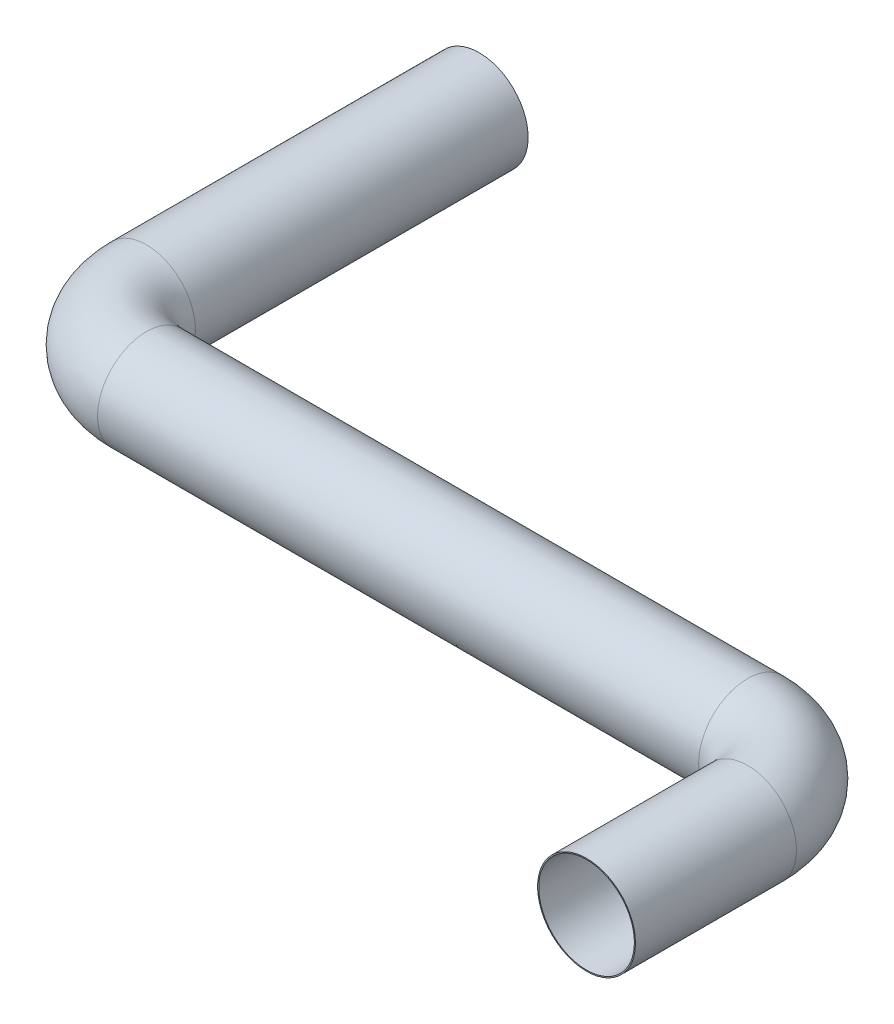
ISO-10303-21;
HEADER;
FILE_DESCRIPTION(('STEP AP214'),'2;1');
FILE_NAME('part.step','',(''),(''),'','','');
FILE_SCHEMA(('AUTOMOTIVE_DESIGN { 1 0 10303 214 1 1 1 1 }'));
ENDSEC;
DATA;
#1=APPLICATION_CONTEXT('core data for automotive mechanical design processes');
#2=APPLICATION_PROTOCOL_DEFINITION('international standard','automotive_design',2000,#1);
#3=PRODUCT_CONTEXT('',#1,'mechanical');
#4=PRODUCT('Part','Part','',(#3));
#5=PRODUCT_RELATED_PRODUCT_CATEGORY('part','',(#4));
#6=PRODUCT_DEFINITION_FORMATION('','',#4);
#7=PRODUCT_DEFINITION_CONTEXT('part definition',#1,'design');
#8=PRODUCT_DEFINITION('design','',#6,#7);
#9=PRODUCT_DEFINITION_SHAPE('','',#8);
#10=(LENGTH_UNIT() NAMED_UNIT(*) SI_UNIT(.MILLI.,.METRE.));
#11=(NAMED_UNIT(*) PLANE_ANGLE_UNIT() SI_UNIT($,.RADIAN.));
#12=(NAMED_UNIT(*) SI_UNIT($,.STERADIAN.) SOLID_ANGLE_UNIT());
#13=UNCERTAINTY_MEASURE_WITH_UNIT(LENGTH_MEASURE(1.E-05),#10,'distance_accuracy_value','');
#14=(GEOMETRIC_REPRESENTATION_CONTEXT(3) GLOBAL_UNCERTAINTY_ASSIGNED_CONTEXT((#13)) GLOBAL_UNIT_ASSIGNED_CONTEXT((#10,
#11,#12)) REPRESENTATION_CONTEXT('',''));
#15=CARTESIAN_POINT('',(0.,0.,0.));
#16=DIRECTION('',(0.,0.,1.));
#17=DIRECTION('',(1.,0.,0.));
#18=AXIS2_PLACEMENT_3D('',#15,#16,#17);
#19=CARTESIAN_POINT('',(0.,0.,0.));
#20=DIRECTION('',(0.,0.,-1.));
#21=DIRECTION('',(-1.,0.,0.));
#22=AXIS2_PLACEMENT_3D('',#19,#20,#21);
#23=CYLINDRICAL_SURFACE('',#22,45.59);
#24=CARTESIAN_POINT('',(0.,0.,-149.999999999999));
#25=DIRECTION('',(0.,0.,1.));
#26=DIRECTION('',(1.,0.,0.));
#27=AXIS2_PLACEMENT_3D('',#24,#25,#26);
#28=CIRCLE('',#27,45.59);
#29=CARTESIAN_POINT('',(45.59,0.,-149.999999999999));
#30=VERTEX_POINT('',#29);
#31=EDGE_CURVE('E69',#30,#30,#28,.T.);
#32=ORIENTED_EDGE('',*,*,#31,.T.);
#33=EDGE_LOOP('',(#32));
#34=FACE_BOUND('',#33,.T.);
#35=CARTESIAN_POINT('',(0.,0.,0.));
#36=DIRECTION('',(0.,0.,1.));
#37=DIRECTION('',(1.,0.,0.));
#38=AXIS2_PLACEMENT_3D('',#35,#36,#37);
#39=CIRCLE('',#38,45.59);
#40=CARTESIAN_POINT('',(45.59,0.,0.));
#41=VERTEX_POINT('',#40);
#42=EDGE_CURVE('E48',#41,#41,#39,.T.);
#43=ORIENTED_EDGE('',*,*,#42,.F.);
#44=EDGE_LOOP('',(#43));
#45=FACE_BOUND('',#44,.T.);
#46=ADVANCED_FACE('F33',(#34,#45),#23,.T.);
#47=CARTESIAN_POINT('',(-70.,0.,-150.));
#48=DIRECTION('',(0.,1.,0.));
#49=DIRECTION('',(0.,0.,1.));
#50=AXIS2_PLACEMENT_3D('',#47,#48,#49);
#51=TOROIDAL_SURFACE('',#50,70.,45.59);
#52=CARTESIAN_POINT('',(-70.0000000000005,0.,-220.));
#53=DIRECTION('',(1.,0.,0.));
#54=DIRECTION('',(0.,0.,-1.));
#55=AXIS2_PLACEMENT_3D('',#52,#53,#54);
#56=CIRCLE('',#55,45.59);
#57=CARTESIAN_POINT('',(-70.0000000000007,0.,-265.59));
#58=VERTEX_POINT('',#57);
#59=EDGE_CURVE('E72',#58,#58,#56,.T.);
#60=CARTESIAN_POINT('',(-70.,0.,-150.));
#61=DIRECTION('',(0.,1.,0.));
#62=DIRECTION('',(0.,0.,1.));
#63=AXIS2_PLACEMENT_3D('',#60,#61,#62);
#64=CIRCLE('',#63,115.59);
#65=EDGE_CURVE('',#30,#58,#64,.T.);
#66=ORIENTED_EDGE('',*,*,#31,.F.);
#67=ORIENTED_EDGE('',*,*,#59,.T.);
#68=ORIENTED_EDGE('',*,*,#65,.T.);
#69=ORIENTED_EDGE('',*,*,#65,.F.);
#70=EDGE_LOOP('',(#66,#68,#67,#69));
#71=FACE_BOUND('',#70,.T.);
#72=ADVANCED_FACE('F107',(#71),#51,.T.);
#73=CARTESIAN_POINT('',(-70.0000000000005,0.,-220.));
#74=DIRECTION('',(-1.,0.,0.));
#75=DIRECTION('',(0.,0.,1.));
#76=AXIS2_PLACEMENT_3D('',#73,#74,#75);
#77=CYLINDRICAL_SURFACE('',#76,45.59);
#78=CARTESIAN_POINT('',(-629.999999999999,0.,-220.));
#79=DIRECTION('',(1.,0.,0.));
#80=DIRECTION('',(0.,0.,-1.));
#81=AXIS2_PLACEMENT_3D('',#78,#79,#80);
#82=CIRCLE('',#81,45.59);
#83=CARTESIAN_POINT('',(-629.999999999999,0.,-174.41));
#84=VERTEX_POINT('',#83);
#85=EDGE_CURVE('E74',#84,#84,#82,.T.);
#86=ORIENTED_EDGE('',*,*,#85,.T.);
#87=EDGE_LOOP('',(#86));
#88=FACE_BOUND('',#87,.T.);
#89=ORIENTED_EDGE('',*,*,#59,.F.);
#90=EDGE_LOOP('',(#89));
#91=FACE_BOUND('',#90,.T.);
#92=ADVANCED_FACE('F113',(#88,#91),#77,.T.);
#93=CARTESIAN_POINT('',(-630.,0.,-290.));
#94=DIRECTION('',(0.,-1.,0.));
#95=DIRECTION('',(0.,0.,-1.));
#96=AXIS2_PLACEMENT_3D('',#93,#94,#95);
#97=TOROIDAL_SURFACE('',#96,70.,45.59);
#98=CARTESIAN_POINT('',(-700.,0.,-290.));
#99=DIRECTION('',(0.,0.,1.));
#100=DIRECTION('',(1.,0.,0.));
#101=AXIS2_PLACEMENT_3D('',#98,#99,#100);
#102=CIRCLE('',#101,45.59);
#103=CARTESIAN_POINT('',(-745.59,0.,-290.000000000001));
#104=VERTEX_POINT('',#103);
#105=EDGE_CURVE('E37',#104,#104,#102,.T.);
#106=CARTESIAN_POINT('',(-630.,0.,-290.));
#107=DIRECTION('',(0.,-1.,0.));
#108=DIRECTION('',(0.,0.,-1.));
#109=AXIS2_PLACEMENT_3D('',#106,#107,#108);
#110=CIRCLE('',#109,115.59);
#111=EDGE_CURVE('',#84,#104,#110,.T.);
#112=ORIENTED_EDGE('',*,*,#85,.F.);
#113=ORIENTED_EDGE('',*,*,#105,.T.);
#114=ORIENTED_EDGE('',*,*,#111,.T.);
#115=ORIENTED_EDGE('',*,*,#111,.F.);
#116=EDGE_LOOP('',(#112,#114,#113,#115));
#117=FACE_BOUND('',#116,.T.);
#118=ADVANCED_FACE('F81',(#117),#97,.T.);
#119=CARTESIAN_POINT('',(-700.,0.,-290.));
#120=DIRECTION('',(0.,0.,-1.));
#121=DIRECTION('',(-1.,0.,0.));
#122=AXIS2_PLACEMENT_3D('',#119,#120,#121);
#123=CYLINDRICAL_SURFACE('',#122,45.59);
#124=ORIENTED_EDGE('',*,*,#105,.F.);
#125=EDGE_LOOP('',(#124));
#126=FACE_BOUND('',#125,.T.);
#127=CARTESIAN_POINT('',(-700.,0.,-600.));
#128=DIRECTION('',(0.,0.,-1.));
#129=DIRECTION('',(-1.,0.,0.));
#130=AXIS2_PLACEMENT_3D('',#127,#128,#129);
#131=CIRCLE('',#130,45.59);
#132=CARTESIAN_POINT('',(-745.59,0.,-600.));
#133=VERTEX_POINT('',#132);
#134=EDGE_CURVE('E62',#133,#133,#131,.T.);
#135=ORIENTED_EDGE('',*,*,#134,.F.);
#136=EDGE_LOOP('',(#135));
#137=FACE_BOUND('',#136,.T.);
#138=ADVANCED_FACE('F35',(#126,#137),#123,.T.);
#139=CARTESIAN_POINT('',(0.,0.,0.));
#140=DIRECTION('',(0.,0.,1.));
#141=DIRECTION('',(1.,0.,0.));
#142=AXIS2_PLACEMENT_3D('',#139,#140,#141);
#143=PLANE('',#142);
#144=CARTESIAN_POINT('',(0.,0.,0.));
#145=DIRECTION('',(0.,0.,1.));
#146=DIRECTION('',(1.,0.,0.));
#147=AXIS2_PLACEMENT_3D('',#144,#145,#146);
#148=CIRCLE('',#147,44.59);
#149=CARTESIAN_POINT('',(44.59,0.,0.));
#150=VERTEX_POINT('',#149);
#151=EDGE_CURVE('E52',#150,#150,#148,.F.);
#152=ORIENTED_EDGE('',*,*,#151,.T.);
#153=EDGE_LOOP('',(#152));
#154=FACE_BOUND('',#153,.T.);
#155=ORIENTED_EDGE('',*,*,#42,.T.);
#156=EDGE_LOOP('',(#155));
#157=FACE_BOUND('',#156,.T.);
#158=ADVANCED_FACE('F86',(#154,#157),#143,.T.);
#159=CARTESIAN_POINT('',(0.,0.,0.));
#160=DIRECTION('',(0.,0.,-1.));
#161=DIRECTION('',(-1.,0.,0.));
#162=AXIS2_PLACEMENT_3D('',#159,#160,#161);
#163=CYLINDRICAL_SURFACE('',#162,44.59);
#164=CARTESIAN_POINT('',(0.,0.,-149.999999999999));
#165=DIRECTION('',(0.,0.,1.));
#166=DIRECTION('',(1.,0.,0.));
#167=AXIS2_PLACEMENT_3D('',#164,#165,#166);
#168=CIRCLE('',#167,44.59);
#169=CARTESIAN_POINT('',(44.59,0.,-149.999999999999));
#170=VERTEX_POINT('',#169);
#171=EDGE_CURVE('E55',#170,#170,#168,.F.);
#172=ORIENTED_EDGE('',*,*,#171,.T.);
#173=EDGE_LOOP('',(#172));
#174=FACE_BOUND('',#173,.T.);
#175=ORIENTED_EDGE('',*,*,#151,.F.);
#176=EDGE_LOOP('',(#175));
#177=FACE_BOUND('',#176,.T.);
#178=ADVANCED_FACE('F53',(#174,#177),#163,.F.);
#179=CARTESIAN_POINT('',(-70.,0.,-150.));
#180=DIRECTION('',(0.,1.,0.));
#181=DIRECTION('',(0.,0.,1.));
#182=AXIS2_PLACEMENT_3D('',#179,#180,#181);
#183=TOROIDAL_SURFACE('',#182,70.,44.59);
#184=CARTESIAN_POINT('',(-70.0000000000005,0.,-220.));
#185=DIRECTION('',(1.,0.,0.));
#186=DIRECTION('',(0.,0.,-1.));
#187=AXIS2_PLACEMENT_3D('',#184,#185,#186);
#188=CIRCLE('',#187,44.59);
#189=CARTESIAN_POINT('',(-70.0000000000007,0.,-264.59));
#190=VERTEX_POINT('',#189);
#191=EDGE_CURVE('E58',#190,#190,#188,.F.);
#192=CARTESIAN_POINT('',(-70.,0.,-150.));
#193=DIRECTION('',(0.,1.,0.));
#194=DIRECTION('',(0.,0.,1.));
#195=AXIS2_PLACEMENT_3D('',#192,#193,#194);
#196=CIRCLE('',#195,114.59);
#197=EDGE_CURVE('',#170,#190,#196,.T.);
#198=ORIENTED_EDGE('',*,*,#171,.F.);
#199=ORIENTED_EDGE('',*,*,#191,.T.);
#200=ORIENTED_EDGE('',*,*,#197,.T.);
#201=ORIENTED_EDGE('',*,*,#197,.F.);
#202=EDGE_LOOP('',(#198,#200,#199,#201));
#203=FACE_BOUND('',#202,.T.);
#204=ADVANCED_FACE('F142',(#203),#183,.F.);
#205=CARTESIAN_POINT('',(-70.0000000000005,0.,-220.));
#206=DIRECTION('',(-1.,0.,0.));
#207=DIRECTION('',(0.,0.,1.));
#208=AXIS2_PLACEMENT_3D('',#205,#206,#207);
#209=CYLINDRICAL_SURFACE('',#208,44.59);
#210=CARTESIAN_POINT('',(-629.999999999999,0.,-220.));
#211=DIRECTION('',(1.,0.,0.));
#212=DIRECTION('',(0.,0.,-1.));
#213=AXIS2_PLACEMENT_3D('',#210,#211,#212);
#214=CIRCLE('',#213,44.59);
#215=CARTESIAN_POINT('',(-629.999999999999,0.,-175.41));
#216=VERTEX_POINT('',#215);
#217=EDGE_CURVE('E42',#216,#216,#214,.F.);
#218=ORIENTED_EDGE('',*,*,#217,.T.);
#219=EDGE_LOOP('',(#218));
#220=FACE_BOUND('',#219,.T.);
#221=ORIENTED_EDGE('',*,*,#191,.F.);
#222=EDGE_LOOP('',(#221));
#223=FACE_BOUND('',#222,.T.);
#224=ADVANCED_FACE('F149',(#220,#223),#209,.F.);
#225=CARTESIAN_POINT('',(-630.,0.,-290.));
#226=DIRECTION('',(0.,-1.,0.));
#227=DIRECTION('',(0.,0.,-1.));
#228=AXIS2_PLACEMENT_3D('',#225,#226,#227);
#229=TOROIDAL_SURFACE('',#228,70.,44.59);
#230=CARTESIAN_POINT('',(-700.,0.,-290.));
#231=DIRECTION('',(0.,0.,1.));
#232=DIRECTION('',(1.,0.,0.));
#233=AXIS2_PLACEMENT_3D('',#230,#231,#232);
#234=CIRCLE('',#233,44.59);
#235=CARTESIAN_POINT('',(-744.59,0.,-290.000000000001));
#236=VERTEX_POINT('',#235);
#237=EDGE_CURVE('E11',#236,#236,#234,.F.);
#238=CARTESIAN_POINT('',(-630.,0.,-290.));
#239=DIRECTION('',(0.,-1.,0.));
#240=DIRECTION('',(0.,0.,-1.));
#241=AXIS2_PLACEMENT_3D('',#238,#239,#240);
#242=CIRCLE('',#241,114.59);
#243=EDGE_CURVE('',#216,#236,#242,.T.);
#244=ORIENTED_EDGE('',*,*,#217,.F.);
#245=ORIENTED_EDGE('',*,*,#237,.T.);
#246=ORIENTED_EDGE('',*,*,#243,.T.);
#247=ORIENTED_EDGE('',*,*,#243,.F.);
#248=EDGE_LOOP('',(#244,#246,#245,#247));
#249=FACE_BOUND('',#248,.T.);
#250=ADVANCED_FACE('F102',(#249),#229,.F.);
#251=CARTESIAN_POINT('',(-700.,0.,-290.));
#252=DIRECTION('',(0.,0.,-1.));
#253=DIRECTION('',(-1.,0.,0.));
#254=AXIS2_PLACEMENT_3D('',#251,#252,#253);
#255=CYLINDRICAL_SURFACE('',#254,44.59);
#256=ORIENTED_EDGE('',*,*,#237,.F.);
#257=EDGE_LOOP('',(#256));
#258=FACE_BOUND('',#257,.T.);
#259=CARTESIAN_POINT('',(-700.,0.,-600.));
#260=DIRECTION('',(0.,0.,-1.));
#261=DIRECTION('',(-1.,0.,0.));
#262=AXIS2_PLACEMENT_3D('',#259,#260,#261);
#263=CIRCLE('',#262,44.59);
#264=CARTESIAN_POINT('',(-744.59,0.,-600.));
#265=VERTEX_POINT('',#264);
#266=EDGE_CURVE('E90',#265,#265,#263,.T.);
#267=ORIENTED_EDGE('',*,*,#266,.T.);
#268=EDGE_LOOP('',(#267));
#269=FACE_BOUND('',#268,.T.);
#270=ADVANCED_FACE('F94',(#258,#269),#255,.F.);
#271=CARTESIAN_POINT('',(-700.,0.,-600.));
#272=DIRECTION('',(0.,0.,-1.));
#273=DIRECTION('',(-1.,0.,0.));
#274=AXIS2_PLACEMENT_3D('',#271,#272,#273);
#275=PLANE('',#274);
#276=ORIENTED_EDGE('',*,*,#134,.T.);
#277=EDGE_LOOP('',(#276));
#278=FACE_BOUND('',#277,.T.);
#279=ORIENTED_EDGE('',*,*,#266,.F.);
#280=EDGE_LOOP('',(#279));
#281=FACE_BOUND('',#280,.T.);
#282=ADVANCED_FACE('F96',(#278,#281),#275,.T.);
#283=CLOSED_SHELL('',(#46,#72,#92,#118,#138,#158,#178,#204,#224,#250,#270,#282));
#284=MANIFOLD_SOLID_BREP('B2',#283);
#285=ADVANCED_BREP_SHAPE_REPRESENTATION('',(#18,#284),#14);
#286=SHAPE_DEFINITION_REPRESENTATION(#9,#285);
ENDSEC;
END-ISO-10303-21;
